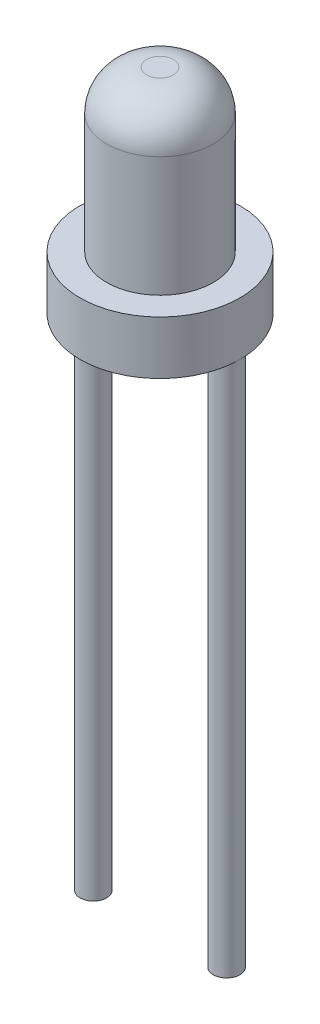
ISO-10303-21;
HEADER;
FILE_DESCRIPTION(('STEP AP214'),'2;1');
FILE_NAME('part.step','',(''),(''),'','','');
FILE_SCHEMA(('AUTOMOTIVE_DESIGN { 1 0 10303 214 1 1 1 1 }'));
ENDSEC;
DATA;
#1=APPLICATION_CONTEXT('core data for automotive mechanical design processes');
#2=APPLICATION_PROTOCOL_DEFINITION('international standard','automotive_design',2000,#1);
#3=PRODUCT_CONTEXT('',#1,'mechanical');
#4=PRODUCT('Part','Part','',(#3));
#5=PRODUCT_RELATED_PRODUCT_CATEGORY('part','',(#4));
#6=PRODUCT_DEFINITION_FORMATION('','',#4);
#7=PRODUCT_DEFINITION_CONTEXT('part definition',#1,'design');
#8=PRODUCT_DEFINITION('design','',#6,#7);
#9=PRODUCT_DEFINITION_SHAPE('','',#8);
#10=(LENGTH_UNIT() NAMED_UNIT(*) SI_UNIT(.MILLI.,.METRE.));
#11=(NAMED_UNIT(*) PLANE_ANGLE_UNIT() SI_UNIT($,.RADIAN.));
#12=(NAMED_UNIT(*) SI_UNIT($,.STERADIAN.) SOLID_ANGLE_UNIT());
#13=UNCERTAINTY_MEASURE_WITH_UNIT(LENGTH_MEASURE(1.E-05),#10,'distance_accuracy_value','');
#14=(GEOMETRIC_REPRESENTATION_CONTEXT(3) GLOBAL_UNCERTAINTY_ASSIGNED_CONTEXT((#13)) GLOBAL_UNIT_ASSIGNED_CONTEXT((#10,
#11,#12)) REPRESENTATION_CONTEXT('',''));
#15=CARTESIAN_POINT('',(0.,0.,0.));
#16=DIRECTION('',(0.,0.,1.));
#17=DIRECTION('',(1.,0.,0.));
#18=AXIS2_PLACEMENT_3D('',#15,#16,#17);
#19=CARTESIAN_POINT('',(0.,4.,0.));
#20=DIRECTION('',(0.,1.,0.));
#21=DIRECTION('',(0.,0.,1.));
#22=AXIS2_PLACEMENT_3D('',#19,#20,#21);
#23=PLANE('',#22);
#24=CARTESIAN_POINT('',(0.,4.,0.));
#25=DIRECTION('',(0.,-1.,0.));
#26=DIRECTION('',(0.,0.,-1.));
#27=AXIS2_PLACEMENT_3D('',#24,#25,#26);
#28=CIRCLE('',#27,0.249999999999999);
#29=CARTESIAN_POINT('',(0.,4.,-0.249999999999999));
#30=VERTEX_POINT('',#29);
#31=EDGE_CURVE('E11',#30,#30,#28,.T.);
#32=ORIENTED_EDGE('',*,*,#31,.F.);
#33=EDGE_LOOP('',(#32));
#34=FACE_BOUND('',#33,.T.);
#35=ADVANCED_FACE('F32',(#34),#23,.T.);
#36=CARTESIAN_POINT('',(0.,3.25,0.));
#37=DIRECTION('',(0.,-1.,0.));
#38=DIRECTION('',(0.,0.,-1.));
#39=AXIS2_PLACEMENT_3D('',#36,#37,#38);
#40=DEGENERATE_TOROIDAL_SURFACE('',#39,0.249999999999999,0.75,.T.);
#41=ORIENTED_EDGE('',*,*,#31,.T.);
#42=EDGE_LOOP('',(#41));
#43=FACE_BOUND('',#42,.T.);
#44=CARTESIAN_POINT('',(0.,3.25,0.));
#45=DIRECTION('',(0.,-1.,0.));
#46=DIRECTION('',(0.,0.,-1.));
#47=AXIS2_PLACEMENT_3D('',#44,#45,#46);
#48=CIRCLE('',#47,0.999999999999999);
#49=CARTESIAN_POINT('',(0.,3.25,-0.999999999999999));
#50=VERTEX_POINT('',#49);
#51=EDGE_CURVE('E39',#50,#50,#48,.T.);
#52=ORIENTED_EDGE('',*,*,#51,.F.);
#53=EDGE_LOOP('',(#52));
#54=FACE_BOUND('',#53,.T.);
#55=ADVANCED_FACE('F74',(#43,#54),#40,.T.);
#56=CARTESIAN_POINT('',(0.,0.,0.));
#57=DIRECTION('',(0.,-1.,0.));
#58=DIRECTION('',(0.,0.,-1.));
#59=AXIS2_PLACEMENT_3D('',#56,#57,#58);
#60=CYLINDRICAL_SURFACE('',#59,0.999999999999999);
#61=ORIENTED_EDGE('',*,*,#51,.T.);
#62=EDGE_LOOP('',(#61));
#63=FACE_BOUND('',#62,.T.);
#64=CARTESIAN_POINT('',(0.,1.,0.));
#65=DIRECTION('',(0.,-1.,0.));
#66=DIRECTION('',(0.,0.,-1.));
#67=AXIS2_PLACEMENT_3D('',#64,#65,#66);
#68=CIRCLE('',#67,1.);
#69=CARTESIAN_POINT('',(0.,1.,-1.));
#70=VERTEX_POINT('',#69);
#71=EDGE_CURVE('E62',#70,#70,#68,.T.);
#72=ORIENTED_EDGE('',*,*,#71,.F.);
#73=EDGE_LOOP('',(#72));
#74=FACE_BOUND('',#73,.T.);
#75=ADVANCED_FACE('F71',(#63,#74),#60,.T.);
#76=CARTESIAN_POINT('',(1.,1.,0.));
#77=DIRECTION('',(0.,1.,0.));
#78=DIRECTION('',(0.,0.,1.));
#79=AXIS2_PLACEMENT_3D('',#76,#77,#78);
#80=PLANE('',#79);
#81=ORIENTED_EDGE('',*,*,#71,.T.);
#82=EDGE_LOOP('',(#81));
#83=FACE_BOUND('',#82,.T.);
#84=CARTESIAN_POINT('',(0.,1.,0.));
#85=DIRECTION('',(0.,-1.,0.));
#86=DIRECTION('',(0.,0.,-1.));
#87=AXIS2_PLACEMENT_3D('',#84,#85,#86);
#88=CIRCLE('',#87,1.5);
#89=CARTESIAN_POINT('',(0.,1.,-1.5));
#90=VERTEX_POINT('',#89);
#91=EDGE_CURVE('E60',#90,#90,#88,.T.);
#92=ORIENTED_EDGE('',*,*,#91,.F.);
#93=EDGE_LOOP('',(#92));
#94=FACE_BOUND('',#93,.T.);
#95=ADVANCED_FACE('F81',(#83,#94),#80,.T.);
#96=CARTESIAN_POINT('',(0.,0.,0.));
#97=DIRECTION('',(0.,-1.,0.));
#98=DIRECTION('',(0.,0.,-1.));
#99=AXIS2_PLACEMENT_3D('',#96,#97,#98);
#100=CYLINDRICAL_SURFACE('',#99,1.5);
#101=ORIENTED_EDGE('',*,*,#91,.T.);
#102=EDGE_LOOP('',(#101));
#103=FACE_BOUND('',#102,.T.);
#104=CARTESIAN_POINT('',(0.,0.,0.));
#105=DIRECTION('',(0.,-1.,0.));
#106=DIRECTION('',(0.,0.,-1.));
#107=AXIS2_PLACEMENT_3D('',#104,#105,#106);
#108=CIRCLE('',#107,1.5);
#109=CARTESIAN_POINT('',(-1.5,0.,0.));
#110=VERTEX_POINT('',#109);
#111=CARTESIAN_POINT('',(1.5,0.,0.));
#112=VERTEX_POINT('',#111);
#113=EDGE_CURVE('E56',#110,#112,#108,.T.);
#114=ORIENTED_EDGE('',*,*,#113,.F.);
#115=EDGE_CURVE('E49',#112,#110,#108,.T.);
#116=ORIENTED_EDGE('',*,*,#115,.F.);
#117=EDGE_LOOP('',(#114,#116));
#118=FACE_BOUND('',#117,.T.);
#119=ADVANCED_FACE('F59',(#103,#118),#100,.T.);
#120=CARTESIAN_POINT('',(1.5,0.,0.));
#121=DIRECTION('',(0.,-1.,0.));
#122=DIRECTION('',(0.,0.,-1.));
#123=AXIS2_PLACEMENT_3D('',#120,#121,#122);
#124=PLANE('',#123);
#125=ORIENTED_EDGE('',*,*,#113,.T.);
#126=CARTESIAN_POINT('',(1.25,0.,0.));
#127=DIRECTION('',(0.,-1.,0.));
#128=DIRECTION('',(0.,0.,1.));
#129=AXIS2_PLACEMENT_3D('',#126,#127,#128);
#130=CIRCLE('',#129,0.25);
#131=EDGE_CURVE('E44',#112,#112,#130,.T.);
#132=ORIENTED_EDGE('',*,*,#131,.F.);
#133=ORIENTED_EDGE('',*,*,#115,.T.);
#134=CARTESIAN_POINT('',(-1.25,0.,0.));
#135=DIRECTION('',(0.,-1.,0.));
#136=DIRECTION('',(0.,0.,-1.));
#137=AXIS2_PLACEMENT_3D('',#134,#135,#136);
#138=CIRCLE('',#137,0.25);
#139=EDGE_CURVE('E54',#110,#110,#138,.T.);
#140=ORIENTED_EDGE('',*,*,#139,.F.);
#141=EDGE_LOOP('',(#125,#132,#133,#140));
#142=FACE_BOUND('',#141,.T.);
#143=ADVANCED_FACE('F52',(#142),#124,.T.);
#144=CARTESIAN_POINT('',(-1.25,-10.,0.));
#145=DIRECTION('',(0.,1.,0.));
#146=DIRECTION('',(0.,0.,1.));
#147=AXIS2_PLACEMENT_3D('',#144,#145,#146);
#148=CYLINDRICAL_SURFACE('',#147,0.25);
#149=CARTESIAN_POINT('',(-1.25,-10.,0.));
#150=DIRECTION('',(0.,-1.,0.));
#151=DIRECTION('',(0.,0.,-1.));
#152=AXIS2_PLACEMENT_3D('',#149,#150,#151);
#153=CIRCLE('',#152,0.25);
#154=CARTESIAN_POINT('',(-1.25,-10.,-0.25));
#155=VERTEX_POINT('',#154);
#156=EDGE_CURVE('E57',#155,#155,#153,.T.);
#157=ORIENTED_EDGE('',*,*,#156,.F.);
#158=EDGE_LOOP('',(#157));
#159=FACE_BOUND('',#158,.T.);
#160=ORIENTED_EDGE('',*,*,#139,.T.);
#161=EDGE_LOOP('',(#160));
#162=FACE_BOUND('',#161,.T.);
#163=ADVANCED_FACE('F93',(#159,#162),#148,.T.);
#164=CARTESIAN_POINT('',(-1.25,-10.,0.));
#165=DIRECTION('',(0.,-1.,0.));
#166=DIRECTION('',(0.,0.,-1.));
#167=AXIS2_PLACEMENT_3D('',#164,#165,#166);
#168=PLANE('',#167);
#169=ORIENTED_EDGE('',*,*,#156,.T.);
#170=EDGE_LOOP('',(#169));
#171=FACE_BOUND('',#170,.T.);
#172=ADVANCED_FACE('F96',(#171),#168,.T.);
#173=CARTESIAN_POINT('',(1.25,-10.,0.));
#174=DIRECTION('',(0.,1.,0.));
#175=DIRECTION('',(0.,0.,1.));
#176=AXIS2_PLACEMENT_3D('',#173,#174,#175);
#177=CYLINDRICAL_SURFACE('',#176,0.25);
#178=CARTESIAN_POINT('',(1.25,-10.,0.));
#179=DIRECTION('',(0.,-1.,0.));
#180=DIRECTION('',(0.,0.,1.));
#181=AXIS2_PLACEMENT_3D('',#178,#179,#180);
#182=CIRCLE('',#181,0.25);
#183=CARTESIAN_POINT('',(1.25,-10.,0.25));
#184=VERTEX_POINT('',#183);
#185=EDGE_CURVE('E112',#184,#184,#182,.T.);
#186=ORIENTED_EDGE('',*,*,#185,.F.);
#187=EDGE_LOOP('',(#186));
#188=FACE_BOUND('',#187,.T.);
#189=ORIENTED_EDGE('',*,*,#131,.T.);
#190=EDGE_LOOP('',(#189));
#191=FACE_BOUND('',#190,.T.);
#192=ADVANCED_FACE('F100',(#188,#191),#177,.T.);
#193=CARTESIAN_POINT('',(1.25,-10.,0.));
#194=DIRECTION('',(0.,1.,0.));
#195=DIRECTION('',(0.,0.,1.));
#196=AXIS2_PLACEMENT_3D('',#193,#194,#195);
#197=PLANE('',#196);
#198=ORIENTED_EDGE('',*,*,#185,.T.);
#199=EDGE_LOOP('',(#198));
#200=FACE_BOUND('',#199,.T.);
#201=ADVANCED_FACE('F104',(#200),#197,.F.);
#202=CLOSED_SHELL('',(#35,#55,#75,#95,#119,#143,#163,#172,#192,#201));
#203=MANIFOLD_SOLID_BREP('B2',#202);
#204=ADVANCED_BREP_SHAPE_REPRESENTATION('',(#18,#203),#14);
#205=SHAPE_DEFINITION_REPRESENTATION(#9,#204);
ENDSEC;
END-ISO-10303-21;
